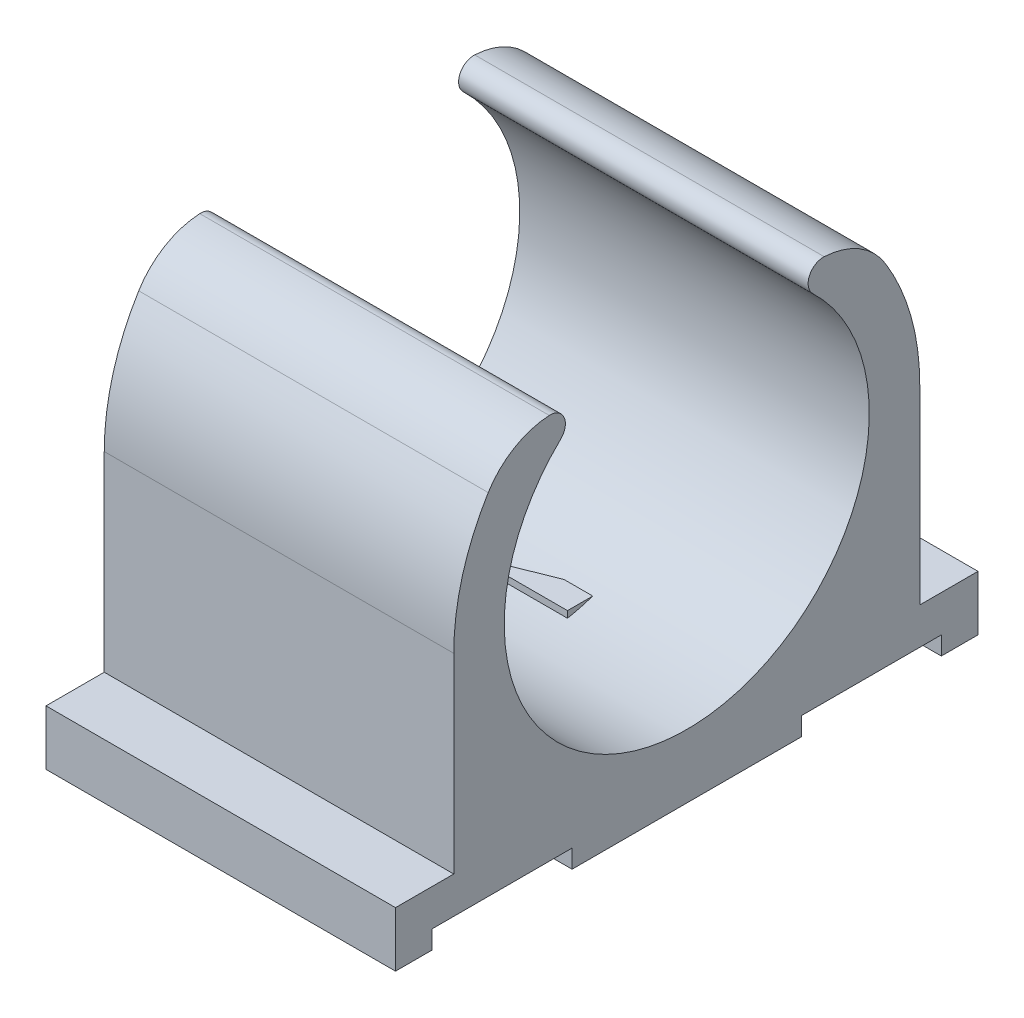
ISO-10303-21;
HEADER;
FILE_DESCRIPTION(('STEP AP214'),'2;1');
FILE_NAME('part.step','',(''),(''),'','','');
FILE_SCHEMA(('AUTOMOTIVE_DESIGN { 1 0 10303 214 1 1 1 1 }'));
ENDSEC;
DATA;
#1=APPLICATION_CONTEXT('core data for automotive mechanical design processes');
#2=APPLICATION_PROTOCOL_DEFINITION('international standard','automotive_design',2000,#1);
#3=PRODUCT_CONTEXT('',#1,'mechanical');
#4=PRODUCT('Part','Part','',(#3));
#5=PRODUCT_RELATED_PRODUCT_CATEGORY('part','',(#4));
#6=PRODUCT_DEFINITION_FORMATION('','',#4);
#7=PRODUCT_DEFINITION_CONTEXT('part definition',#1,'design');
#8=PRODUCT_DEFINITION('design','',#6,#7);
#9=PRODUCT_DEFINITION_SHAPE('','',#8);
#10=(LENGTH_UNIT() NAMED_UNIT(*) SI_UNIT(.MILLI.,.METRE.));
#11=(NAMED_UNIT(*) PLANE_ANGLE_UNIT() SI_UNIT($,.RADIAN.));
#12=(NAMED_UNIT(*) SI_UNIT($,.STERADIAN.) SOLID_ANGLE_UNIT());
#13=UNCERTAINTY_MEASURE_WITH_UNIT(LENGTH_MEASURE(1.E-05),#10,'distance_accuracy_value','');
#14=(GEOMETRIC_REPRESENTATION_CONTEXT(3) GLOBAL_UNCERTAINTY_ASSIGNED_CONTEXT((#13)) GLOBAL_UNIT_ASSIGNED_CONTEXT((#10,
#11,#12)) REPRESENTATION_CONTEXT('',''));
#15=CARTESIAN_POINT('',(0.,0.,0.));
#16=DIRECTION('',(0.,0.,1.));
#17=DIRECTION('',(1.,0.,0.));
#18=AXIS2_PLACEMENT_3D('',#15,#16,#17);
#19=CARTESIAN_POINT('',(-11.43,14.9,0.));
#20=DIRECTION('',(1.,0.,0.));
#21=DIRECTION('',(0.,0.,-1.));
#22=AXIS2_PLACEMENT_3D('',#19,#20,#21);
#23=CYLINDRICAL_SURFACE('',#22,11.938);
#24=CARTESIAN_POINT('',(-10.07,14.9,0.));
#25=DIRECTION('',(0.371390676354104,0.,0.92847669088526));
#26=DIRECTION('',(0.928476690885259,0.,-0.371390676354104));
#27=AXIS2_PLACEMENT_3D('',#24,#25,#26);
#28=ELLIPSE('',#27,32.1440487337859,11.938);
#29=CARTESIAN_POINT('',(-0.443914346942473,3.6,-3.85043426122301));
#30=VERTEX_POINT('',#29);
#31=CARTESIAN_POINT('',(-4.57,3.16646498279398,-2.2));
#32=VERTEX_POINT('',#31);
#33=EDGE_CURVE('E468',#30,#32,#28,.F.);
#34=ORIENTED_EDGE('',*,*,#33,.F.);
#35=DIRECTION('',(1.,0.,0.));
#36=VECTOR('',#35,1.);
#37=CARTESIAN_POINT('',(-11.43,3.6,-3.85043426122301));
#38=LINE('',#37,#36);
#39=CARTESIAN_POINT('',(1.43,3.6,-3.85043426122301));
#40=VERTEX_POINT('',#39);
#41=EDGE_CURVE('E461',#40,#30,#38,.F.);
#42=ORIENTED_EDGE('',*,*,#41,.F.);
#43=CARTESIAN_POINT('',(1.43,14.9,0.));
#44=DIRECTION('',(-1.,0.,0.));
#45=DIRECTION('',(0.,0.,1.));
#46=AXIS2_PLACEMENT_3D('',#43,#44,#45);
#47=CIRCLE('',#46,11.938);
#48=CARTESIAN_POINT('',(1.43,3.16646498279398,-2.2));
#49=VERTEX_POINT('',#48);
#50=EDGE_CURVE('E464',#49,#40,#47,.F.);
#51=ORIENTED_EDGE('',*,*,#50,.F.);
#52=DIRECTION('',(1.,0.,0.));
#53=VECTOR('',#52,1.);
#54=CARTESIAN_POINT('',(-11.43,3.16646498279398,-2.2));
#55=LINE('',#54,#53);
#56=EDGE_CURVE('E56',#32,#49,#55,.T.);
#57=ORIENTED_EDGE('',*,*,#56,.F.);
#58=EDGE_LOOP('',(#34,#42,#51,#57));
#59=FACE_BOUND('',#58,.T.);
#60=CARTESIAN_POINT('',(11.43,14.9,0.));
#61=DIRECTION('',(1.,0.,0.));
#62=DIRECTION('',(0.,0.,-1.));
#63=AXIS2_PLACEMENT_3D('',#60,#61,#62);
#64=CIRCLE('',#63,11.938);
#65=CARTESIAN_POINT('',(11.43,23.531318512451,8.24719253665273));
#66=VERTEX_POINT('',#65);
#67=CARTESIAN_POINT('',(11.43,23.531318512451,-8.24719253665274));
#68=VERTEX_POINT('',#67);
#69=EDGE_CURVE('E291',#66,#68,#64,.T.);
#70=ORIENTED_EDGE('',*,*,#69,.T.);
#71=DIRECTION('',(1.,0.,0.));
#72=VECTOR('',#71,1.);
#73=CARTESIAN_POINT('',(-11.43,23.531318512451,-8.24719253665273));
#74=LINE('',#73,#72);
#75=CARTESIAN_POINT('',(-11.43,23.531318512451,-8.24719253665273));
#76=VERTEX_POINT('',#75);
#77=EDGE_CURVE('E452',#68,#76,#74,.F.);
#78=ORIENTED_EDGE('',*,*,#77,.T.);
#79=CARTESIAN_POINT('',(-11.43,14.9,0.));
#80=DIRECTION('',(1.,0.,0.));
#81=DIRECTION('',(0.,0.,-1.));
#82=AXIS2_PLACEMENT_3D('',#79,#80,#81);
#83=CIRCLE('',#82,11.938);
#84=CARTESIAN_POINT('',(-11.43,23.531318512451,8.24719253665274));
#85=VERTEX_POINT('',#84);
#86=EDGE_CURVE('E292',#85,#76,#83,.T.);
#87=ORIENTED_EDGE('',*,*,#86,.F.);
#88=DIRECTION('',(1.,0.,0.));
#89=VECTOR('',#88,1.);
#90=CARTESIAN_POINT('',(-11.43,23.531318512451,8.24719253665274));
#91=LINE('',#90,#89);
#92=EDGE_CURVE('E450',#85,#66,#91,.T.);
#93=ORIENTED_EDGE('',*,*,#92,.T.);
#94=EDGE_LOOP('',(#70,#78,#87,#93));
#95=FACE_BOUND('',#94,.T.);
#96=CARTESIAN_POINT('',(1.43,14.9,0.));
#97=DIRECTION('',(-1.,0.,0.));
#98=DIRECTION('',(0.,0.,1.));
#99=AXIS2_PLACEMENT_3D('',#96,#97,#98);
#100=CIRCLE('',#99,11.938);
#101=CARTESIAN_POINT('',(1.43,3.6,3.850434261223));
#102=VERTEX_POINT('',#101);
#103=CARTESIAN_POINT('',(1.43,3.16646498279398,2.2));
#104=VERTEX_POINT('',#103);
#105=EDGE_CURVE('E11',#102,#104,#100,.F.);
#106=ORIENTED_EDGE('',*,*,#105,.F.);
#107=DIRECTION('',(1.,0.,0.));
#108=VECTOR('',#107,1.);
#109=CARTESIAN_POINT('',(-11.43,3.6,3.850434261223));
#110=LINE('',#109,#108);
#111=CARTESIAN_POINT('',(-0.443914346942504,3.6,3.850434261223));
#112=VERTEX_POINT('',#111);
#113=EDGE_CURVE('E245',#102,#112,#110,.F.);
#114=ORIENTED_EDGE('',*,*,#113,.T.);
#115=CARTESIAN_POINT('',(-10.07,14.9,0.));
#116=DIRECTION('',(0.371390676354104,0.,-0.928476690885259));
#117=DIRECTION('',(0.92847669088526,0.,0.371390676354104));
#118=AXIS2_PLACEMENT_3D('',#115,#116,#117);
#119=ELLIPSE('',#118,32.1440487337858,11.938);
#120=CARTESIAN_POINT('',(-4.57,3.16646498279398,2.2));
#121=VERTEX_POINT('',#120);
#122=EDGE_CURVE('E471',#121,#112,#119,.F.);
#123=ORIENTED_EDGE('',*,*,#122,.F.);
#124=DIRECTION('',(1.,0.,0.));
#125=VECTOR('',#124,1.);
#126=CARTESIAN_POINT('',(-11.43,3.16646498279398,2.2));
#127=LINE('',#126,#125);
#128=EDGE_CURVE('E41',#104,#121,#127,.F.);
#129=ORIENTED_EDGE('',*,*,#128,.F.);
#130=EDGE_LOOP('',(#106,#114,#123,#129));
#131=FACE_BOUND('',#130,.T.);
#132=ADVANCED_FACE('F33',(#59,#95,#131),#23,.F.);
#133=CARTESIAN_POINT('',(-11.43,25.26,-15.24));
#134=DIRECTION('',(0.,0.,1.));
#135=DIRECTION('',(1.,0.,0.));
#136=AXIS2_PLACEMENT_3D('',#133,#134,#135);
#137=PLANE('',#136);
#138=DIRECTION('',(1.,0.,0.));
#139=VECTOR('',#138,1.);
#140=CARTESIAN_POINT('',(-11.43,14.9,-15.24));
#141=LINE('',#140,#139);
#142=CARTESIAN_POINT('',(-11.43,14.9,-15.24));
#143=VERTEX_POINT('',#142);
#144=CARTESIAN_POINT('',(11.43,14.9,-15.24));
#145=VERTEX_POINT('',#144);
#146=EDGE_CURVE('E279',#143,#145,#141,.T.);
#147=ORIENTED_EDGE('',*,*,#146,.T.);
#148=DIRECTION('',(0.,-1.,0.));
#149=VECTOR('',#148,1.);
#150=CARTESIAN_POINT('',(11.43,25.26,-15.24));
#151=LINE('',#150,#149);
#152=CARTESIAN_POINT('',(11.43,2.4,-15.24));
#153=VERTEX_POINT('',#152);
#154=EDGE_CURVE('E309',#145,#153,#151,.T.);
#155=ORIENTED_EDGE('',*,*,#154,.T.);
#156=DIRECTION('',(-1.,0.,0.));
#157=VECTOR('',#156,1.);
#158=CARTESIAN_POINT('',(-11.43,2.4,-15.24));
#159=LINE('',#158,#157);
#160=CARTESIAN_POINT('',(-11.43,2.4,-15.24));
#161=VERTEX_POINT('',#160);
#162=EDGE_CURVE('E295',#153,#161,#159,.T.);
#163=ORIENTED_EDGE('',*,*,#162,.T.);
#164=DIRECTION('',(0.,-1.,0.));
#165=VECTOR('',#164,1.);
#166=CARTESIAN_POINT('',(-11.43,25.26,-15.24));
#167=LINE('',#166,#165);
#168=EDGE_CURVE('E307',#143,#161,#167,.T.);
#169=ORIENTED_EDGE('',*,*,#168,.F.);
#170=EDGE_LOOP('',(#147,#155,#163,#169));
#171=FACE_BOUND('',#170,.T.);
#172=ADVANCED_FACE('F477',(#171),#137,.F.);
#173=CARTESIAN_POINT('',(11.43,2.4,-19.05));
#174=DIRECTION('',(-1.,0.,0.));
#175=DIRECTION('',(0.,0.,1.));
#176=AXIS2_PLACEMENT_3D('',#173,#174,#175);
#177=PLANE('',#176);
#178=CARTESIAN_POINT('',(11.43,20.26,-8.72513610209033));
#179=DIRECTION('',(-1.,0.,0.));
#180=DIRECTION('',(0.,0.,1.));
#181=AXIS2_PLACEMENT_3D('',#178,#179,#180);
#182=CIRCLE('',#181,5.);
#183=CARTESIAN_POINT('',(11.43,22.8771875,-12.9854564644391));
#184=VERTEX_POINT('',#183);
#185=CARTESIAN_POINT('',(11.43,25.2529132721238,-8.99125084623285));
#186=VERTEX_POINT('',#185);
#187=EDGE_CURVE('E433',#184,#186,#182,.F.);
#188=ORIENTED_EDGE('',*,*,#187,.T.);
#189=CARTESIAN_POINT('',(11.43,24.254330617699,-8.93802789740435));
#190=DIRECTION('',(-1.,0.,0.));
#191=DIRECTION('',(0.,0.,1.));
#192=AXIS2_PLACEMENT_3D('',#189,#190,#191);
#193=CIRCLE('',#192,1.);
#194=EDGE_CURVE('E448',#186,#68,#193,.F.);
#195=ORIENTED_EDGE('',*,*,#194,.T.);
#196=ORIENTED_EDGE('',*,*,#69,.F.);
#197=CARTESIAN_POINT('',(11.43,24.254330617699,8.93802789740434));
#198=DIRECTION('',(-1.,0.,0.));
#199=DIRECTION('',(0.,0.,1.));
#200=AXIS2_PLACEMENT_3D('',#197,#198,#199);
#201=CIRCLE('',#200,1.);
#202=CARTESIAN_POINT('',(11.43,25.2529132721238,8.99125084623285));
#203=VERTEX_POINT('',#202);
#204=EDGE_CURVE('E446',#66,#203,#201,.F.);
#205=ORIENTED_EDGE('',*,*,#204,.T.);
#206=CARTESIAN_POINT('',(11.43,20.26,8.72513610209033));
#207=DIRECTION('',(-1.,0.,0.));
#208=DIRECTION('',(0.,0.,1.));
#209=AXIS2_PLACEMENT_3D('',#206,#207,#208);
#210=CIRCLE('',#209,5.);
#211=CARTESIAN_POINT('',(11.43,22.8771875,12.9854564644391));
#212=VERTEX_POINT('',#211);
#213=EDGE_CURVE('E431',#203,#212,#210,.F.);
#214=ORIENTED_EDGE('',*,*,#213,.T.);
#215=CARTESIAN_POINT('',(11.43,14.9,0.));
#216=DIRECTION('',(-1.,0.,0.));
#217=DIRECTION('',(0.,0.,-1.));
#218=AXIS2_PLACEMENT_3D('',#215,#216,#217);
#219=CIRCLE('',#218,15.24);
#220=CARTESIAN_POINT('',(11.43,14.9,15.24));
#221=VERTEX_POINT('',#220);
#222=EDGE_CURVE('E283',#221,#212,#219,.T.);
#223=ORIENTED_EDGE('',*,*,#222,.F.);
#224=DIRECTION('',(0.,-1.,0.));
#225=VECTOR('',#224,1.);
#226=CARTESIAN_POINT('',(11.43,25.26,15.24));
#227=LINE('',#226,#225);
#228=CARTESIAN_POINT('',(11.43,2.4,15.24));
#229=VERTEX_POINT('',#228);
#230=EDGE_CURVE('E303',#221,#229,#227,.T.);
#231=ORIENTED_EDGE('',*,*,#230,.T.);
#232=DIRECTION('',(0.,0.,-1.));
#233=VECTOR('',#232,1.);
#234=CARTESIAN_POINT('',(11.43,2.4,-19.05));
#235=LINE('',#234,#233);
#236=CARTESIAN_POINT('',(11.43,2.4,19.05));
#237=VERTEX_POINT('',#236);
#238=EDGE_CURVE('E403',#237,#229,#235,.T.);
#239=ORIENTED_EDGE('',*,*,#238,.F.);
#240=DIRECTION('',(0.,-1.,0.));
#241=VECTOR('',#240,1.);
#242=CARTESIAN_POINT('',(11.43,2.4,19.05));
#243=LINE('',#242,#241);
#244=CARTESIAN_POINT('',(11.43,-1.2,19.05));
#245=VERTEX_POINT('',#244);
#246=EDGE_CURVE('E415',#237,#245,#243,.T.);
#247=ORIENTED_EDGE('',*,*,#246,.T.);
#248=DIRECTION('',(0.,0.,1.));
#249=VECTOR('',#248,1.);
#250=CARTESIAN_POINT('',(11.43,-1.2,19.05));
#251=LINE('',#250,#249);
#252=CARTESIAN_POINT('',(11.43,-1.2,16.65));
#253=VERTEX_POINT('',#252);
#254=EDGE_CURVE('E339',#253,#245,#251,.T.);
#255=ORIENTED_EDGE('',*,*,#254,.F.);
#256=DIRECTION('',(0.,1.,0.));
#257=VECTOR('',#256,1.);
#258=CARTESIAN_POINT('',(11.43,-1.2,16.65));
#259=LINE('',#258,#257);
#260=CARTESIAN_POINT('',(11.43,0.,16.65));
#261=VERTEX_POINT('',#260);
#262=EDGE_CURVE('E349',#253,#261,#259,.T.);
#263=ORIENTED_EDGE('',*,*,#262,.T.);
#264=DIRECTION('',(0.,0.,-1.));
#265=VECTOR('',#264,1.);
#266=CARTESIAN_POINT('',(11.43,0.,-19.05));
#267=LINE('',#266,#265);
#268=CARTESIAN_POINT('',(11.43,0.,7.49999999999999));
#269=VERTEX_POINT('',#268);
#270=EDGE_CURVE('E416',#261,#269,#267,.T.);
#271=ORIENTED_EDGE('',*,*,#270,.T.);
#272=DIRECTION('',(0.,1.,0.));
#273=VECTOR('',#272,1.);
#274=CARTESIAN_POINT('',(11.43,-1.2,7.5));
#275=LINE('',#274,#273);
#276=CARTESIAN_POINT('',(11.43,-1.2,7.5));
#277=VERTEX_POINT('',#276);
#278=EDGE_CURVE('E393',#277,#269,#275,.T.);
#279=ORIENTED_EDGE('',*,*,#278,.F.);
#280=DIRECTION('',(0.,0.,1.));
#281=VECTOR('',#280,1.);
#282=CARTESIAN_POINT('',(11.43,-1.2,7.5));
#283=LINE('',#282,#281);
#284=CARTESIAN_POINT('',(11.43,-1.2,-7.5));
#285=VERTEX_POINT('',#284);
#286=EDGE_CURVE('E381',#285,#277,#283,.T.);
#287=ORIENTED_EDGE('',*,*,#286,.F.);
#288=DIRECTION('',(0.,1.,0.));
#289=VECTOR('',#288,1.);
#290=CARTESIAN_POINT('',(11.43,-1.2,-7.5));
#291=LINE('',#290,#289);
#292=CARTESIAN_POINT('',(11.43,0.,-7.5));
#293=VERTEX_POINT('',#292);
#294=EDGE_CURVE('E396',#285,#293,#291,.T.);
#295=ORIENTED_EDGE('',*,*,#294,.T.);
#296=CARTESIAN_POINT('',(11.43,0.,-16.65));
#297=VERTEX_POINT('',#296);
#298=EDGE_CURVE('E402',#293,#297,#267,.T.);
#299=ORIENTED_EDGE('',*,*,#298,.T.);
#300=DIRECTION('',(0.,1.,0.));
#301=VECTOR('',#300,1.);
#302=CARTESIAN_POINT('',(11.43,-1.2,-16.65));
#303=LINE('',#302,#301);
#304=CARTESIAN_POINT('',(11.43,-1.2,-16.65));
#305=VERTEX_POINT('',#304);
#306=EDGE_CURVE('E371',#305,#297,#303,.T.);
#307=ORIENTED_EDGE('',*,*,#306,.F.);
#308=DIRECTION('',(0.,0.,1.));
#309=VECTOR('',#308,1.);
#310=CARTESIAN_POINT('',(11.43,-1.2,-19.05));
#311=LINE('',#310,#309);
#312=CARTESIAN_POINT('',(11.43,-1.2,-19.05));
#313=VERTEX_POINT('',#312);
#314=EDGE_CURVE('E356',#313,#305,#311,.T.);
#315=ORIENTED_EDGE('',*,*,#314,.F.);
#316=DIRECTION('',(0.,-1.,0.));
#317=VECTOR('',#316,1.);
#318=CARTESIAN_POINT('',(11.43,2.4,-19.05));
#319=LINE('',#318,#317);
#320=CARTESIAN_POINT('',(11.43,2.4,-19.05));
#321=VERTEX_POINT('',#320);
#322=EDGE_CURVE('E426',#321,#313,#319,.T.);
#323=ORIENTED_EDGE('',*,*,#322,.F.);
#324=EDGE_CURVE('E407',#153,#321,#235,.T.);
#325=ORIENTED_EDGE('',*,*,#324,.F.);
#326=ORIENTED_EDGE('',*,*,#154,.F.);
#327=CARTESIAN_POINT('',(11.43,14.9,0.));
#328=DIRECTION('',(-1.,0.,0.));
#329=DIRECTION('',(0.,0.,-1.));
#330=AXIS2_PLACEMENT_3D('',#327,#328,#329);
#331=CIRCLE('',#330,15.24);
#332=EDGE_CURVE('E276',#184,#145,#331,.T.);
#333=ORIENTED_EDGE('',*,*,#332,.F.);
#334=EDGE_LOOP('',(#188,#195,#196,#205,#214,#223,#231,#239,#247,#255,#263,#271,#279,#287,#295,
#299,#307,#315,#323,#325,#326,#333));
#335=FACE_BOUND('',#334,.T.);
#336=ADVANCED_FACE('F482',(#335),#177,.F.);
#337=CARTESIAN_POINT('',(-11.43,2.4,-19.05));
#338=DIRECTION('',(1.,0.,0.));
#339=DIRECTION('',(0.,0.,-1.));
#340=AXIS2_PLACEMENT_3D('',#337,#338,#339);
#341=PLANE('',#340);
#342=ORIENTED_EDGE('',*,*,#86,.T.);
#343=CARTESIAN_POINT('',(-11.43,24.254330617699,-8.93802789740434));
#344=DIRECTION('',(1.,0.,0.));
#345=DIRECTION('',(0.,0.,-1.));
#346=AXIS2_PLACEMENT_3D('',#343,#344,#345);
#347=CIRCLE('',#346,1.);
#348=CARTESIAN_POINT('',(-11.43,25.2529132721238,-8.99125084623285));
#349=VERTEX_POINT('',#348);
#350=EDGE_CURVE('E456',#76,#349,#347,.F.);
#351=ORIENTED_EDGE('',*,*,#350,.T.);
#352=CARTESIAN_POINT('',(-11.43,20.26,-8.72513610209033));
#353=DIRECTION('',(1.,0.,0.));
#354=DIRECTION('',(0.,0.,-1.));
#355=AXIS2_PLACEMENT_3D('',#352,#353,#354);
#356=CIRCLE('',#355,5.);
#357=CARTESIAN_POINT('',(-11.43,22.8771875,-12.9854564644391));
#358=VERTEX_POINT('',#357);
#359=EDGE_CURVE('E439',#349,#358,#356,.F.);
#360=ORIENTED_EDGE('',*,*,#359,.T.);
#361=CARTESIAN_POINT('',(-11.43,14.9,0.));
#362=DIRECTION('',(-1.,0.,0.));
#363=DIRECTION('',(0.,0.,-1.));
#364=AXIS2_PLACEMENT_3D('',#361,#362,#363);
#365=CIRCLE('',#364,15.24);
#366=EDGE_CURVE('E277',#358,#143,#365,.T.);
#367=ORIENTED_EDGE('',*,*,#366,.T.);
#368=ORIENTED_EDGE('',*,*,#168,.T.);
#369=DIRECTION('',(0.,0.,1.));
#370=VECTOR('',#369,1.);
#371=CARTESIAN_POINT('',(-11.43,2.4,-19.05));
#372=LINE('',#371,#370);
#373=CARTESIAN_POINT('',(-11.43,2.4,-19.05));
#374=VERTEX_POINT('',#373);
#375=EDGE_CURVE('E410',#374,#161,#372,.T.);
#376=ORIENTED_EDGE('',*,*,#375,.F.);
#377=DIRECTION('',(0.,-1.,0.));
#378=VECTOR('',#377,1.);
#379=CARTESIAN_POINT('',(-11.43,2.4,-19.05));
#380=LINE('',#379,#378);
#381=CARTESIAN_POINT('',(-11.43,-1.2,-19.05));
#382=VERTEX_POINT('',#381);
#383=EDGE_CURVE('E424',#374,#382,#380,.T.);
#384=ORIENTED_EDGE('',*,*,#383,.T.);
#385=DIRECTION('',(0.,0.,-1.));
#386=VECTOR('',#385,1.);
#387=CARTESIAN_POINT('',(-11.43,-1.2,-19.05));
#388=LINE('',#387,#386);
#389=CARTESIAN_POINT('',(-11.43,-1.2,-16.65));
#390=VERTEX_POINT('',#389);
#391=EDGE_CURVE('E361',#390,#382,#388,.T.);
#392=ORIENTED_EDGE('',*,*,#391,.F.);
#393=DIRECTION('',(0.,1.,0.));
#394=VECTOR('',#393,1.);
#395=CARTESIAN_POINT('',(-11.43,-1.2,-16.65));
#396=LINE('',#395,#394);
#397=CARTESIAN_POINT('',(-11.43,0.,-16.65));
#398=VERTEX_POINT('',#397);
#399=EDGE_CURVE('E367',#390,#398,#396,.T.);
#400=ORIENTED_EDGE('',*,*,#399,.T.);
#401=DIRECTION('',(0.,0.,1.));
#402=VECTOR('',#401,1.);
#403=CARTESIAN_POINT('',(-11.43,0.,-19.05));
#404=LINE('',#403,#402);
#405=CARTESIAN_POINT('',(-11.43,0.,-7.5));
#406=VERTEX_POINT('',#405);
#407=EDGE_CURVE('E419',#398,#406,#404,.T.);
#408=ORIENTED_EDGE('',*,*,#407,.T.);
#409=DIRECTION('',(0.,1.,0.));
#410=VECTOR('',#409,1.);
#411=CARTESIAN_POINT('',(-11.43,-1.2,-7.5));
#412=LINE('',#411,#410);
#413=CARTESIAN_POINT('',(-11.43,-1.2,-7.5));
#414=VERTEX_POINT('',#413);
#415=EDGE_CURVE('E399',#414,#406,#412,.T.);
#416=ORIENTED_EDGE('',*,*,#415,.F.);
#417=DIRECTION('',(0.,0.,-1.));
#418=VECTOR('',#417,1.);
#419=CARTESIAN_POINT('',(-11.43,-1.2,7.5));
#420=LINE('',#419,#418);
#421=CARTESIAN_POINT('',(-11.43,-1.2,7.5));
#422=VERTEX_POINT('',#421);
#423=EDGE_CURVE('E374',#422,#414,#420,.T.);
#424=ORIENTED_EDGE('',*,*,#423,.F.);
#425=DIRECTION('',(0.,1.,0.));
#426=VECTOR('',#425,1.);
#427=CARTESIAN_POINT('',(-11.43,-1.2,7.5));
#428=LINE('',#427,#426);
#429=CARTESIAN_POINT('',(-11.43,0.,7.49999999999999));
#430=VERTEX_POINT('',#429);
#431=EDGE_CURVE('E386',#422,#430,#428,.T.);
#432=ORIENTED_EDGE('',*,*,#431,.T.);
#433=CARTESIAN_POINT('',(-11.43,0.,16.65));
#434=VERTEX_POINT('',#433);
#435=EDGE_CURVE('E418',#430,#434,#404,.T.);
#436=ORIENTED_EDGE('',*,*,#435,.T.);
#437=DIRECTION('',(0.,1.,0.));
#438=VECTOR('',#437,1.);
#439=CARTESIAN_POINT('',(-11.43,-1.2,16.65));
#440=LINE('',#439,#438);
#441=CARTESIAN_POINT('',(-11.43,-1.2,16.65));
#442=VERTEX_POINT('',#441);
#443=EDGE_CURVE('E353',#442,#434,#440,.T.);
#444=ORIENTED_EDGE('',*,*,#443,.F.);
#445=DIRECTION('',(0.,0.,-1.));
#446=VECTOR('',#445,1.);
#447=CARTESIAN_POINT('',(-11.43,-1.2,19.05));
#448=LINE('',#447,#446);
#449=CARTESIAN_POINT('',(-11.43,-1.2,19.05));
#450=VERTEX_POINT('',#449);
#451=EDGE_CURVE('E345',#450,#442,#448,.T.);
#452=ORIENTED_EDGE('',*,*,#451,.F.);
#453=DIRECTION('',(0.,-1.,0.));
#454=VECTOR('',#453,1.);
#455=CARTESIAN_POINT('',(-11.43,2.4,19.05));
#456=LINE('',#455,#454);
#457=CARTESIAN_POINT('',(-11.43,2.4,19.05));
#458=VERTEX_POINT('',#457);
#459=EDGE_CURVE('E422',#458,#450,#456,.T.);
#460=ORIENTED_EDGE('',*,*,#459,.F.);
#461=CARTESIAN_POINT('',(-11.43,2.4,15.24));
#462=VERTEX_POINT('',#461);
#463=EDGE_CURVE('E409',#462,#458,#372,.T.);
#464=ORIENTED_EDGE('',*,*,#463,.F.);
#465=DIRECTION('',(0.,-1.,0.));
#466=VECTOR('',#465,1.);
#467=CARTESIAN_POINT('',(-11.43,25.26,15.24));
#468=LINE('',#467,#466);
#469=CARTESIAN_POINT('',(-11.43,14.9,15.24));
#470=VERTEX_POINT('',#469);
#471=EDGE_CURVE('E305',#470,#462,#468,.T.);
#472=ORIENTED_EDGE('',*,*,#471,.F.);
#473=CARTESIAN_POINT('',(-11.43,14.9,0.));
#474=DIRECTION('',(-1.,0.,0.));
#475=DIRECTION('',(0.,0.,-1.));
#476=AXIS2_PLACEMENT_3D('',#473,#474,#475);
#477=CIRCLE('',#476,15.24);
#478=CARTESIAN_POINT('',(-11.43,22.8771875,12.9854564644391));
#479=VERTEX_POINT('',#478);
#480=EDGE_CURVE('E284',#470,#479,#477,.T.);
#481=ORIENTED_EDGE('',*,*,#480,.T.);
#482=CARTESIAN_POINT('',(-11.43,20.26,8.72513610209033));
#483=DIRECTION('',(1.,0.,0.));
#484=DIRECTION('',(0.,0.,-1.));
#485=AXIS2_PLACEMENT_3D('',#482,#483,#484);
#486=CIRCLE('',#485,5.);
#487=CARTESIAN_POINT('',(-11.43,25.2529132721238,8.99125084623285));
#488=VERTEX_POINT('',#487);
#489=EDGE_CURVE('E436',#479,#488,#486,.F.);
#490=ORIENTED_EDGE('',*,*,#489,.T.);
#491=CARTESIAN_POINT('',(-11.43,24.254330617699,8.93802789740435));
#492=DIRECTION('',(1.,0.,0.));
#493=DIRECTION('',(0.,0.,-1.));
#494=AXIS2_PLACEMENT_3D('',#491,#492,#493);
#495=CIRCLE('',#494,1.);
#496=EDGE_CURVE('E454',#488,#85,#495,.F.);
#497=ORIENTED_EDGE('',*,*,#496,.T.);
#498=EDGE_LOOP('',(#342,#351,#360,#367,#368,#376,#384,#392,#400,#408,#416,#424,#432,#436,#444,
#452,#460,#464,#472,#481,#490,#497));
#499=FACE_BOUND('',#498,.T.);
#500=ADVANCED_FACE('F550',(#499),#341,.F.);
#501=CARTESIAN_POINT('',(0.,2.4,0.));
#502=DIRECTION('',(0.,1.,0.));
#503=DIRECTION('',(0.,0.,1.));
#504=AXIS2_PLACEMENT_3D('',#501,#502,#503);
#505=PLANE('',#504);
#506=DIRECTION('',(1.,0.,0.));
#507=VECTOR('',#506,1.);
#508=CARTESIAN_POINT('',(-11.43,2.4,15.24));
#509=LINE('',#508,#507);
#510=EDGE_CURVE('E300',#462,#229,#509,.T.);
#511=ORIENTED_EDGE('',*,*,#510,.F.);
#512=ORIENTED_EDGE('',*,*,#463,.T.);
#513=DIRECTION('',(1.,0.,0.));
#514=VECTOR('',#513,1.);
#515=CARTESIAN_POINT('',(-11.43,2.4,19.05));
#516=LINE('',#515,#514);
#517=EDGE_CURVE('E413',#458,#237,#516,.T.);
#518=ORIENTED_EDGE('',*,*,#517,.T.);
#519=ORIENTED_EDGE('',*,*,#238,.T.);
#520=EDGE_LOOP('',(#511,#512,#518,#519));
#521=FACE_BOUND('',#520,.T.);
#522=ADVANCED_FACE('F527',(#521),#505,.T.);
#523=CARTESIAN_POINT('',(0.,-1.2,0.));
#524=DIRECTION('',(0.,1.,0.));
#525=DIRECTION('',(0.,0.,1.));
#526=AXIS2_PLACEMENT_3D('',#523,#524,#525);
#527=PLANE('',#526);
#528=DIRECTION('',(0.,0.,1.));
#529=VECTOR('',#528,1.);
#530=CARTESIAN_POINT('',(7.5,-1.2,-7.5));
#531=LINE('',#530,#529);
#532=CARTESIAN_POINT('',(7.5,-1.2,-7.5));
#533=VERTEX_POINT('',#532);
#534=CARTESIAN_POINT('',(7.5,-1.2,7.5));
#535=VERTEX_POINT('',#534);
#536=EDGE_CURVE('E311',#533,#535,#531,.T.);
#537=ORIENTED_EDGE('',*,*,#536,.F.);
#538=DIRECTION('',(1.,0.,0.));
#539=VECTOR('',#538,1.);
#540=CARTESIAN_POINT('',(11.43,-1.2,-7.5));
#541=LINE('',#540,#539);
#542=EDGE_CURVE('E377',#533,#285,#541,.T.);
#543=ORIENTED_EDGE('',*,*,#542,.T.);
#544=ORIENTED_EDGE('',*,*,#286,.T.);
#545=DIRECTION('',(-1.,0.,0.));
#546=VECTOR('',#545,1.);
#547=CARTESIAN_POINT('',(11.43,-1.2,7.5));
#548=LINE('',#547,#546);
#549=EDGE_CURVE('E384',#277,#535,#548,.T.);
#550=ORIENTED_EDGE('',*,*,#549,.T.);
#551=EDGE_LOOP('',(#537,#543,#544,#550));
#552=FACE_BOUND('',#551,.T.);
#553=ADVANCED_FACE('F523',(#552),#527,.F.);
#554=DIRECTION('',(0.,0.,-1.));
#555=VECTOR('',#554,1.);
#556=CARTESIAN_POINT('',(-7.5,-1.2,-7.5));
#557=LINE('',#556,#555);
#558=CARTESIAN_POINT('',(-7.5,-1.2,7.5));
#559=VERTEX_POINT('',#558);
#560=CARTESIAN_POINT('',(-7.5,-1.2,-7.5));
#561=VERTEX_POINT('',#560);
#562=EDGE_CURVE('E316',#559,#561,#557,.T.);
#563=ORIENTED_EDGE('',*,*,#562,.F.);
#564=EDGE_CURVE('E383',#559,#422,#548,.T.);
#565=ORIENTED_EDGE('',*,*,#564,.T.);
#566=ORIENTED_EDGE('',*,*,#423,.T.);
#567=EDGE_CURVE('E379',#414,#561,#541,.T.);
#568=ORIENTED_EDGE('',*,*,#567,.T.);
#569=EDGE_LOOP('',(#563,#565,#566,#568));
#570=FACE_BOUND('',#569,.T.);
#571=ADVANCED_FACE('F526',(#570),#527,.F.);
#572=CARTESIAN_POINT('',(0.,0.,0.));
#573=DIRECTION('',(0.,1.,0.));
#574=DIRECTION('',(0.,0.,1.));
#575=AXIS2_PLACEMENT_3D('',#572,#573,#574);
#576=PLANE('',#575);
#577=DIRECTION('',(1.,0.,0.));
#578=VECTOR('',#577,1.);
#579=CARTESIAN_POINT('',(11.43,0.,16.65));
#580=LINE('',#579,#578);
#581=EDGE_CURVE('E338',#434,#261,#580,.T.);
#582=ORIENTED_EDGE('',*,*,#581,.F.);
#583=ORIENTED_EDGE('',*,*,#435,.F.);
#584=DIRECTION('',(-1.,0.,0.));
#585=VECTOR('',#584,1.);
#586=CARTESIAN_POINT('',(11.43,0.,7.5));
#587=LINE('',#586,#585);
#588=EDGE_CURVE('E378',#269,#430,#587,.T.);
#589=ORIENTED_EDGE('',*,*,#588,.F.);
#590=ORIENTED_EDGE('',*,*,#270,.F.);
#591=EDGE_LOOP('',(#582,#583,#589,#590));
#592=FACE_BOUND('',#591,.T.);
#593=ADVANCED_FACE('F541',(#592),#576,.F.);
#594=DIRECTION('',(-1.,0.,0.));
#595=VECTOR('',#594,1.);
#596=CARTESIAN_POINT('',(11.43,0.,-16.65));
#597=LINE('',#596,#595);
#598=EDGE_CURVE('E355',#297,#398,#597,.T.);
#599=ORIENTED_EDGE('',*,*,#598,.F.);
#600=ORIENTED_EDGE('',*,*,#298,.F.);
#601=DIRECTION('',(1.,0.,0.));
#602=VECTOR('',#601,1.);
#603=CARTESIAN_POINT('',(11.43,0.,-7.5));
#604=LINE('',#603,#602);
#605=EDGE_CURVE('E373',#406,#293,#604,.T.);
#606=ORIENTED_EDGE('',*,*,#605,.F.);
#607=ORIENTED_EDGE('',*,*,#407,.F.);
#608=EDGE_LOOP('',(#599,#600,#606,#607));
#609=FACE_BOUND('',#608,.T.);
#610=ADVANCED_FACE('F544',(#609),#576,.F.);
#611=CARTESIAN_POINT('',(-11.43,2.4,-19.05));
#612=DIRECTION('',(0.,0.,1.));
#613=DIRECTION('',(1.,0.,0.));
#614=AXIS2_PLACEMENT_3D('',#611,#612,#613);
#615=PLANE('',#614);
#616=ORIENTED_EDGE('',*,*,#322,.T.);
#617=DIRECTION('',(1.,0.,0.));
#618=VECTOR('',#617,1.);
#619=CARTESIAN_POINT('',(11.43,-1.2,-19.05));
#620=LINE('',#619,#618);
#621=EDGE_CURVE('E364',#382,#313,#620,.T.);
#622=ORIENTED_EDGE('',*,*,#621,.F.);
#623=ORIENTED_EDGE('',*,*,#383,.F.);
#624=DIRECTION('',(-1.,0.,0.));
#625=VECTOR('',#624,1.);
#626=CARTESIAN_POINT('',(-11.43,2.4,-19.05));
#627=LINE('',#626,#625);
#628=EDGE_CURVE('E406',#321,#374,#627,.T.);
#629=ORIENTED_EDGE('',*,*,#628,.F.);
#630=EDGE_LOOP('',(#616,#622,#623,#629));
#631=FACE_BOUND('',#630,.T.);
#632=ADVANCED_FACE('F548',(#631),#615,.F.);
#633=CARTESIAN_POINT('',(-11.43,2.4,19.05));
#634=DIRECTION('',(0.,0.,-1.));
#635=DIRECTION('',(-1.,0.,0.));
#636=AXIS2_PLACEMENT_3D('',#633,#634,#635);
#637=PLANE('',#636);
#638=ORIENTED_EDGE('',*,*,#459,.T.);
#639=DIRECTION('',(-1.,0.,0.));
#640=VECTOR('',#639,1.);
#641=CARTESIAN_POINT('',(11.43,-1.2,19.05));
#642=LINE('',#641,#640);
#643=EDGE_CURVE('E342',#245,#450,#642,.T.);
#644=ORIENTED_EDGE('',*,*,#643,.F.);
#645=ORIENTED_EDGE('',*,*,#246,.F.);
#646=ORIENTED_EDGE('',*,*,#517,.F.);
#647=EDGE_LOOP('',(#638,#644,#645,#646));
#648=FACE_BOUND('',#647,.T.);
#649=ADVANCED_FACE('F539',(#648),#637,.F.);
#650=ORIENTED_EDGE('',*,*,#162,.F.);
#651=ORIENTED_EDGE('',*,*,#324,.T.);
#652=ORIENTED_EDGE('',*,*,#628,.T.);
#653=ORIENTED_EDGE('',*,*,#375,.T.);
#654=EDGE_LOOP('',(#650,#651,#652,#653));
#655=FACE_BOUND('',#654,.T.);
#656=ADVANCED_FACE('F535',(#655),#505,.T.);
#657=CARTESIAN_POINT('',(11.43,-1.2,-7.5));
#658=DIRECTION('',(0.,0.,1.));
#659=DIRECTION('',(1.,0.,0.));
#660=AXIS2_PLACEMENT_3D('',#657,#658,#659);
#661=PLANE('',#660);
#662=ORIENTED_EDGE('',*,*,#605,.T.);
#663=ORIENTED_EDGE('',*,*,#294,.F.);
#664=ORIENTED_EDGE('',*,*,#542,.F.);
#665=DIRECTION('',(0.,1.,0.));
#666=VECTOR('',#665,1.);
#667=CARTESIAN_POINT('',(7.5,-3.2,-7.5));
#668=LINE('',#667,#666);
#669=CARTESIAN_POINT('',(7.5,-3.2,-7.5));
#670=VERTEX_POINT('',#669);
#671=EDGE_CURVE('E322',#670,#533,#668,.T.);
#672=ORIENTED_EDGE('',*,*,#671,.F.);
#673=DIRECTION('',(1.,0.,0.));
#674=VECTOR('',#673,1.);
#675=CARTESIAN_POINT('',(-7.5,-3.2,-7.5));
#676=LINE('',#675,#674);
#677=CARTESIAN_POINT('',(-7.5,-3.2,-7.5));
#678=VERTEX_POINT('',#677);
#679=EDGE_CURVE('E320',#678,#670,#676,.T.);
#680=ORIENTED_EDGE('',*,*,#679,.F.);
#681=DIRECTION('',(0.,1.,0.));
#682=VECTOR('',#681,1.);
#683=CARTESIAN_POINT('',(-7.5,-3.2,-7.5));
#684=LINE('',#683,#682);
#685=EDGE_CURVE('E329',#678,#561,#684,.T.);
#686=ORIENTED_EDGE('',*,*,#685,.T.);
#687=ORIENTED_EDGE('',*,*,#567,.F.);
#688=ORIENTED_EDGE('',*,*,#415,.T.);
#689=EDGE_LOOP('',(#662,#663,#664,#672,#680,#686,#687,#688));
#690=FACE_BOUND('',#689,.T.);
#691=ADVANCED_FACE('F531',(#690),#661,.F.);
#692=CARTESIAN_POINT('',(11.43,-1.2,7.5));
#693=DIRECTION('',(0.,0.,-1.));
#694=DIRECTION('',(-1.,0.,0.));
#695=AXIS2_PLACEMENT_3D('',#692,#693,#694);
#696=PLANE('',#695);
#697=ORIENTED_EDGE('',*,*,#588,.T.);
#698=ORIENTED_EDGE('',*,*,#431,.F.);
#699=ORIENTED_EDGE('',*,*,#564,.F.);
#700=DIRECTION('',(0.,1.,0.));
#701=VECTOR('',#700,1.);
#702=CARTESIAN_POINT('',(-7.5,-3.2,7.5));
#703=LINE('',#702,#701);
#704=CARTESIAN_POINT('',(-7.5,-3.2,7.5));
#705=VERTEX_POINT('',#704);
#706=EDGE_CURVE('E332',#705,#559,#703,.T.);
#707=ORIENTED_EDGE('',*,*,#706,.F.);
#708=DIRECTION('',(-1.,0.,0.));
#709=VECTOR('',#708,1.);
#710=CARTESIAN_POINT('',(-7.5,-3.2,7.5));
#711=LINE('',#710,#709);
#712=CARTESIAN_POINT('',(7.5,-3.2,7.5));
#713=VERTEX_POINT('',#712);
#714=EDGE_CURVE('E315',#713,#705,#711,.T.);
#715=ORIENTED_EDGE('',*,*,#714,.F.);
#716=DIRECTION('',(0.,1.,0.));
#717=VECTOR('',#716,1.);
#718=CARTESIAN_POINT('',(7.5,-3.2,7.5));
#719=LINE('',#718,#717);
#720=EDGE_CURVE('E335',#713,#535,#719,.T.);
#721=ORIENTED_EDGE('',*,*,#720,.T.);
#722=ORIENTED_EDGE('',*,*,#549,.F.);
#723=ORIENTED_EDGE('',*,*,#278,.T.);
#724=EDGE_LOOP('',(#697,#698,#699,#707,#715,#721,#722,#723));
#725=FACE_BOUND('',#724,.T.);
#726=ADVANCED_FACE('F521',(#725),#696,.F.);
#727=CARTESIAN_POINT('',(11.43,-1.2,-16.65));
#728=DIRECTION('',(0.,0.,-1.));
#729=DIRECTION('',(-1.,0.,0.));
#730=AXIS2_PLACEMENT_3D('',#727,#728,#729);
#731=PLANE('',#730);
#732=ORIENTED_EDGE('',*,*,#598,.T.);
#733=ORIENTED_EDGE('',*,*,#399,.F.);
#734=DIRECTION('',(-1.,0.,0.));
#735=VECTOR('',#734,1.);
#736=CARTESIAN_POINT('',(11.43,-1.2,-16.65));
#737=LINE('',#736,#735);
#738=EDGE_CURVE('E359',#305,#390,#737,.T.);
#739=ORIENTED_EDGE('',*,*,#738,.F.);
#740=ORIENTED_EDGE('',*,*,#306,.T.);
#741=EDGE_LOOP('',(#732,#733,#739,#740));
#742=FACE_BOUND('',#741,.T.);
#743=ADVANCED_FACE('F517',(#742),#731,.F.);
#744=CARTESIAN_POINT('',(0.,-1.2,0.));
#745=DIRECTION('',(0.,-1.,0.));
#746=DIRECTION('',(0.,0.,-1.));
#747=AXIS2_PLACEMENT_3D('',#744,#745,#746);
#748=PLANE('',#747);
#749=ORIENTED_EDGE('',*,*,#314,.T.);
#750=ORIENTED_EDGE('',*,*,#738,.T.);
#751=ORIENTED_EDGE('',*,*,#391,.T.);
#752=ORIENTED_EDGE('',*,*,#621,.T.);
#753=EDGE_LOOP('',(#749,#750,#751,#752));
#754=FACE_BOUND('',#753,.T.);
#755=ADVANCED_FACE('F513',(#754),#748,.T.);
#756=CARTESIAN_POINT('',(11.43,-1.2,16.65));
#757=DIRECTION('',(0.,0.,1.));
#758=DIRECTION('',(1.,0.,0.));
#759=AXIS2_PLACEMENT_3D('',#756,#757,#758);
#760=PLANE('',#759);
#761=ORIENTED_EDGE('',*,*,#581,.T.);
#762=ORIENTED_EDGE('',*,*,#262,.F.);
#763=DIRECTION('',(1.,0.,0.));
#764=VECTOR('',#763,1.);
#765=CARTESIAN_POINT('',(11.43,-1.2,16.65));
#766=LINE('',#765,#764);
#767=EDGE_CURVE('E347',#442,#253,#766,.T.);
#768=ORIENTED_EDGE('',*,*,#767,.F.);
#769=ORIENTED_EDGE('',*,*,#443,.T.);
#770=EDGE_LOOP('',(#761,#762,#768,#769));
#771=FACE_BOUND('',#770,.T.);
#772=ADVANCED_FACE('F509',(#771),#760,.F.);
#773=CARTESIAN_POINT('',(0.,-1.2,0.));
#774=DIRECTION('',(0.,1.,0.));
#775=DIRECTION('',(0.,0.,1.));
#776=AXIS2_PLACEMENT_3D('',#773,#774,#775);
#777=PLANE('',#776);
#778=ORIENTED_EDGE('',*,*,#254,.T.);
#779=ORIENTED_EDGE('',*,*,#643,.T.);
#780=ORIENTED_EDGE('',*,*,#451,.T.);
#781=ORIENTED_EDGE('',*,*,#767,.T.);
#782=EDGE_LOOP('',(#778,#779,#780,#781));
#783=FACE_BOUND('',#782,.T.);
#784=ADVANCED_FACE('F505',(#783),#777,.F.);
#785=CARTESIAN_POINT('',(7.5,-3.2,-7.5));
#786=DIRECTION('',(-1.,0.,0.));
#787=DIRECTION('',(0.,0.,1.));
#788=AXIS2_PLACEMENT_3D('',#785,#786,#787);
#789=PLANE('',#788);
#790=ORIENTED_EDGE('',*,*,#536,.T.);
#791=ORIENTED_EDGE('',*,*,#720,.F.);
#792=DIRECTION('',(0.,0.,1.));
#793=VECTOR('',#792,1.);
#794=CARTESIAN_POINT('',(7.5,-3.2,-7.5));
#795=LINE('',#794,#793);
#796=EDGE_CURVE('E312',#670,#713,#795,.T.);
#797=ORIENTED_EDGE('',*,*,#796,.F.);
#798=ORIENTED_EDGE('',*,*,#671,.T.);
#799=EDGE_LOOP('',(#790,#791,#797,#798));
#800=FACE_BOUND('',#799,.T.);
#801=ADVANCED_FACE('F501',(#800),#789,.F.);
#802=CARTESIAN_POINT('',(-7.5,-3.2,-7.5));
#803=DIRECTION('',(1.,0.,0.));
#804=DIRECTION('',(0.,0.,-1.));
#805=AXIS2_PLACEMENT_3D('',#802,#803,#804);
#806=PLANE('',#805);
#807=ORIENTED_EDGE('',*,*,#562,.T.);
#808=ORIENTED_EDGE('',*,*,#685,.F.);
#809=DIRECTION('',(0.,0.,-1.));
#810=VECTOR('',#809,1.);
#811=CARTESIAN_POINT('',(-7.5,-3.2,-7.5));
#812=LINE('',#811,#810);
#813=EDGE_CURVE('E318',#705,#678,#812,.T.);
#814=ORIENTED_EDGE('',*,*,#813,.F.);
#815=ORIENTED_EDGE('',*,*,#706,.T.);
#816=EDGE_LOOP('',(#807,#808,#814,#815));
#817=FACE_BOUND('',#816,.T.);
#818=ADVANCED_FACE('F497',(#817),#806,.F.);
#819=CARTESIAN_POINT('',(0.,-3.2,0.));
#820=DIRECTION('',(0.,1.,0.));
#821=DIRECTION('',(0.,0.,1.));
#822=AXIS2_PLACEMENT_3D('',#819,#820,#821);
#823=PLANE('',#822);
#824=ORIENTED_EDGE('',*,*,#796,.T.);
#825=ORIENTED_EDGE('',*,*,#714,.T.);
#826=ORIENTED_EDGE('',*,*,#813,.T.);
#827=ORIENTED_EDGE('',*,*,#679,.T.);
#828=EDGE_LOOP('',(#824,#825,#826,#827));
#829=FACE_BOUND('',#828,.T.);
#830=ADVANCED_FACE('F492',(#829),#823,.F.);
#831=CARTESIAN_POINT('',(-11.43,25.26,15.24));
#832=DIRECTION('',(0.,0.,-1.));
#833=DIRECTION('',(-1.,0.,0.));
#834=AXIS2_PLACEMENT_3D('',#831,#832,#833);
#835=PLANE('',#834);
#836=ORIENTED_EDGE('',*,*,#230,.F.);
#837=DIRECTION('',(1.,0.,0.));
#838=VECTOR('',#837,1.);
#839=CARTESIAN_POINT('',(-11.43,14.9,15.24));
#840=LINE('',#839,#838);
#841=EDGE_CURVE('E287',#470,#221,#840,.T.);
#842=ORIENTED_EDGE('',*,*,#841,.F.);
#843=ORIENTED_EDGE('',*,*,#471,.T.);
#844=ORIENTED_EDGE('',*,*,#510,.T.);
#845=EDGE_LOOP('',(#836,#842,#843,#844));
#846=FACE_BOUND('',#845,.T.);
#847=ADVANCED_FACE('F490',(#846),#835,.F.);
#848=CARTESIAN_POINT('',(-11.43,14.9,0.));
#849=DIRECTION('',(1.,0.,0.));
#850=DIRECTION('',(0.,0.,-1.));
#851=AXIS2_PLACEMENT_3D('',#848,#849,#850);
#852=CYLINDRICAL_SURFACE('',#851,15.24);
#853=ORIENTED_EDGE('',*,*,#222,.T.);
#854=DIRECTION('',(1.,0.,0.));
#855=VECTOR('',#854,1.);
#856=CARTESIAN_POINT('',(-11.43,22.8771875,12.9854564644391));
#857=LINE('',#856,#855);
#858=EDGE_CURVE('E441',#212,#479,#857,.F.);
#859=ORIENTED_EDGE('',*,*,#858,.T.);
#860=ORIENTED_EDGE('',*,*,#480,.F.);
#861=ORIENTED_EDGE('',*,*,#841,.T.);
#862=EDGE_LOOP('',(#853,#859,#860,#861));
#863=FACE_BOUND('',#862,.T.);
#864=ADVANCED_FACE('F488',(#863),#852,.T.);
#865=CARTESIAN_POINT('',(-11.43,14.9,0.));
#866=DIRECTION('',(1.,0.,0.));
#867=DIRECTION('',(0.,0.,-1.));
#868=AXIS2_PLACEMENT_3D('',#865,#866,#867);
#869=CYLINDRICAL_SURFACE('',#868,15.24);
#870=ORIENTED_EDGE('',*,*,#366,.F.);
#871=DIRECTION('',(1.,0.,0.));
#872=VECTOR('',#871,1.);
#873=CARTESIAN_POINT('',(-11.43,22.8771875,-12.9854564644391));
#874=LINE('',#873,#872);
#875=EDGE_CURVE('E428',#358,#184,#874,.T.);
#876=ORIENTED_EDGE('',*,*,#875,.T.);
#877=ORIENTED_EDGE('',*,*,#332,.T.);
#878=ORIENTED_EDGE('',*,*,#146,.F.);
#879=EDGE_LOOP('',(#870,#876,#877,#878));
#880=FACE_BOUND('',#879,.T.);
#881=ADVANCED_FACE('F564',(#880),#869,.T.);
#882=CARTESIAN_POINT('',(-11.43,20.26,-8.72513610209033));
#883=DIRECTION('',(1.,0.,0.));
#884=DIRECTION('',(0.,0.,-1.));
#885=AXIS2_PLACEMENT_3D('',#882,#883,#884);
#886=CYLINDRICAL_SURFACE('',#885,5.);
#887=ORIENTED_EDGE('',*,*,#359,.F.);
#888=DIRECTION('',(1.,0.,0.));
#889=VECTOR('',#888,1.);
#890=CARTESIAN_POINT('',(-11.43,25.2529132721238,-8.99125084623285));
#891=LINE('',#890,#889);
#892=EDGE_CURVE('E443',#349,#186,#891,.T.);
#893=ORIENTED_EDGE('',*,*,#892,.T.);
#894=ORIENTED_EDGE('',*,*,#187,.F.);
#895=ORIENTED_EDGE('',*,*,#875,.F.);
#896=EDGE_LOOP('',(#887,#893,#894,#895));
#897=FACE_BOUND('',#896,.T.);
#898=ADVANCED_FACE('F560',(#897),#886,.T.);
#899=CARTESIAN_POINT('',(-11.43,20.26,8.72513610209033));
#900=DIRECTION('',(1.,0.,0.));
#901=DIRECTION('',(0.,0.,-1.));
#902=AXIS2_PLACEMENT_3D('',#899,#900,#901);
#903=CYLINDRICAL_SURFACE('',#902,5.);
#904=ORIENTED_EDGE('',*,*,#213,.F.);
#905=DIRECTION('',(1.,0.,0.));
#906=VECTOR('',#905,1.);
#907=CARTESIAN_POINT('',(-11.43,25.2529132721238,8.99125084623285));
#908=LINE('',#907,#906);
#909=EDGE_CURVE('E458',#203,#488,#908,.F.);
#910=ORIENTED_EDGE('',*,*,#909,.T.);
#911=ORIENTED_EDGE('',*,*,#489,.F.);
#912=ORIENTED_EDGE('',*,*,#858,.F.);
#913=EDGE_LOOP('',(#904,#910,#911,#912));
#914=FACE_BOUND('',#913,.T.);
#915=ADVANCED_FACE('F563',(#914),#903,.T.);
#916=CARTESIAN_POINT('',(-11.43,24.254330617699,-8.93802789740434));
#917=DIRECTION('',(-1.,0.,0.));
#918=DIRECTION('',(0.,0.,1.));
#919=AXIS2_PLACEMENT_3D('',#916,#917,#918);
#920=CYLINDRICAL_SURFACE('',#919,1.);
#921=ORIENTED_EDGE('',*,*,#350,.F.);
#922=ORIENTED_EDGE('',*,*,#77,.F.);
#923=ORIENTED_EDGE('',*,*,#194,.F.);
#924=ORIENTED_EDGE('',*,*,#892,.F.);
#925=EDGE_LOOP('',(#921,#922,#923,#924));
#926=FACE_BOUND('',#925,.T.);
#927=ADVANCED_FACE('F567',(#926),#920,.T.);
#928=CARTESIAN_POINT('',(-11.43,24.254330617699,8.93802789740435));
#929=DIRECTION('',(1.,0.,0.));
#930=DIRECTION('',(0.,0.,-1.));
#931=AXIS2_PLACEMENT_3D('',#928,#929,#930);
#932=CYLINDRICAL_SURFACE('',#931,1.);
#933=ORIENTED_EDGE('',*,*,#204,.F.);
#934=ORIENTED_EDGE('',*,*,#92,.F.);
#935=ORIENTED_EDGE('',*,*,#496,.F.);
#936=ORIENTED_EDGE('',*,*,#909,.F.);
#937=EDGE_LOOP('',(#933,#934,#935,#936));
#938=FACE_BOUND('',#937,.T.);
#939=ADVANCED_FACE('F35',(#938),#932,.T.);
#940=CARTESIAN_POINT('',(1.43,3.6,-4.6));
#941=DIRECTION('',(0.371390676354104,0.,0.92847669088526));
#942=DIRECTION('',(0.928476690885259,0.,-0.371390676354104));
#943=AXIS2_PLACEMENT_3D('',#940,#941,#942);
#944=PLANE('',#943);
#945=DIRECTION('',(-0.928476690885259,0.,0.371390676354104));
#946=VECTOR('',#945,1.);
#947=CARTESIAN_POINT('',(1.43,3.6,-4.6));
#948=LINE('',#947,#946);
#949=CARTESIAN_POINT('',(-4.57,3.6,-2.2));
#950=VERTEX_POINT('',#949);
#951=EDGE_CURVE('E259',#30,#950,#948,.T.);
#952=ORIENTED_EDGE('',*,*,#951,.F.);
#953=ORIENTED_EDGE('',*,*,#33,.T.);
#954=DIRECTION('',(0.,-1.,0.));
#955=VECTOR('',#954,1.);
#956=CARTESIAN_POINT('',(-4.57,3.6,-2.2));
#957=LINE('',#956,#955);
#958=EDGE_CURVE('E273',#950,#32,#957,.T.);
#959=ORIENTED_EDGE('',*,*,#958,.F.);
#960=EDGE_LOOP('',(#952,#953,#959));
#961=FACE_BOUND('',#960,.T.);
#962=ADVANCED_FACE('F574',(#961),#944,.F.);
#963=CARTESIAN_POINT('',(-4.57,3.6,-2.2));
#964=DIRECTION('',(0.,0.,-1.));
#965=DIRECTION('',(-1.,0.,0.));
#966=AXIS2_PLACEMENT_3D('',#963,#964,#965);
#967=PLANE('',#966);
#968=ORIENTED_EDGE('',*,*,#958,.T.);
#969=ORIENTED_EDGE('',*,*,#56,.T.);
#970=DIRECTION('',(0.,-1.,0.));
#971=VECTOR('',#970,1.);
#972=CARTESIAN_POINT('',(1.43,3.6,-2.2));
#973=LINE('',#972,#971);
#974=CARTESIAN_POINT('',(1.43,3.6,-2.2));
#975=VERTEX_POINT('',#974);
#976=EDGE_CURVE('E270',#975,#49,#973,.T.);
#977=ORIENTED_EDGE('',*,*,#976,.F.);
#978=DIRECTION('',(1.,0.,0.));
#979=VECTOR('',#978,1.);
#980=CARTESIAN_POINT('',(-4.57,3.6,-2.2));
#981=LINE('',#980,#979);
#982=EDGE_CURVE('E261',#950,#975,#981,.T.);
#983=ORIENTED_EDGE('',*,*,#982,.F.);
#984=EDGE_LOOP('',(#968,#969,#977,#983));
#985=FACE_BOUND('',#984,.T.);
#986=ADVANCED_FACE('F652',(#985),#967,.F.);
#987=CARTESIAN_POINT('',(1.43,3.6,-2.2));
#988=DIRECTION('',(-1.,0.,0.));
#989=DIRECTION('',(0.,0.,1.));
#990=AXIS2_PLACEMENT_3D('',#987,#988,#989);
#991=PLANE('',#990);
#992=ORIENTED_EDGE('',*,*,#976,.T.);
#993=ORIENTED_EDGE('',*,*,#50,.T.);
#994=DIRECTION('',(0.,0.,-1.));
#995=VECTOR('',#994,1.);
#996=CARTESIAN_POINT('',(1.43,3.6,-2.2));
#997=LINE('',#996,#995);
#998=EDGE_CURVE('E267',#975,#40,#997,.T.);
#999=ORIENTED_EDGE('',*,*,#998,.F.);
#1000=EDGE_LOOP('',(#992,#993,#999));
#1001=FACE_BOUND('',#1000,.T.);
#1002=ADVANCED_FACE('F656',(#1001),#991,.F.);
#1003=CARTESIAN_POINT('',(0.,3.6,0.));
#1004=DIRECTION('',(0.,-1.,0.));
#1005=DIRECTION('',(0.,0.,-1.));
#1006=AXIS2_PLACEMENT_3D('',#1003,#1004,#1005);
#1007=PLANE('',#1006);
#1008=ORIENTED_EDGE('',*,*,#998,.T.);
#1009=ORIENTED_EDGE('',*,*,#41,.T.);
#1010=ORIENTED_EDGE('',*,*,#951,.T.);
#1011=ORIENTED_EDGE('',*,*,#982,.T.);
#1012=EDGE_LOOP('',(#1008,#1009,#1010,#1011));
#1013=FACE_BOUND('',#1012,.T.);
#1014=ADVANCED_FACE('F660',(#1013),#1007,.F.);
#1015=CARTESIAN_POINT('',(1.43,3.6,2.2));
#1016=DIRECTION('',(-1.,0.,0.));
#1017=DIRECTION('',(0.,0.,1.));
#1018=AXIS2_PLACEMENT_3D('',#1015,#1016,#1017);
#1019=PLANE('',#1018);
#1020=DIRECTION('',(0.,0.,-1.));
#1021=VECTOR('',#1020,1.);
#1022=CARTESIAN_POINT('',(1.43,3.6,2.2));
#1023=LINE('',#1022,#1021);
#1024=CARTESIAN_POINT('',(1.43,3.6,2.2));
#1025=VERTEX_POINT('',#1024);
#1026=EDGE_CURVE('E239',#102,#1025,#1023,.T.);
#1027=ORIENTED_EDGE('',*,*,#1026,.F.);
#1028=ORIENTED_EDGE('',*,*,#105,.T.);
#1029=DIRECTION('',(0.,-1.,0.));
#1030=VECTOR('',#1029,1.);
#1031=CARTESIAN_POINT('',(1.43,3.6,2.2));
#1032=LINE('',#1031,#1030);
#1033=EDGE_CURVE('E253',#1025,#104,#1032,.T.);
#1034=ORIENTED_EDGE('',*,*,#1033,.F.);
#1035=EDGE_LOOP('',(#1027,#1028,#1034));
#1036=FACE_BOUND('',#1035,.T.);
#1037=ADVANCED_FACE('F258',(#1036),#1019,.F.);
#1038=CARTESIAN_POINT('',(-4.57,3.6,2.2));
#1039=DIRECTION('',(0.,0.,1.));
#1040=DIRECTION('',(1.,0.,0.));
#1041=AXIS2_PLACEMENT_3D('',#1038,#1039,#1040);
#1042=PLANE('',#1041);
#1043=ORIENTED_EDGE('',*,*,#1033,.T.);
#1044=ORIENTED_EDGE('',*,*,#128,.T.);
#1045=DIRECTION('',(0.,-1.,0.));
#1046=VECTOR('',#1045,1.);
#1047=CARTESIAN_POINT('',(-4.57,3.6,2.2));
#1048=LINE('',#1047,#1046);
#1049=CARTESIAN_POINT('',(-4.57,3.6,2.2));
#1050=VERTEX_POINT('',#1049);
#1051=EDGE_CURVE('E256',#1050,#121,#1048,.T.);
#1052=ORIENTED_EDGE('',*,*,#1051,.F.);
#1053=DIRECTION('',(-1.,0.,0.));
#1054=VECTOR('',#1053,1.);
#1055=CARTESIAN_POINT('',(-4.57,3.6,2.2));
#1056=LINE('',#1055,#1054);
#1057=EDGE_CURVE('E242',#1025,#1050,#1056,.T.);
#1058=ORIENTED_EDGE('',*,*,#1057,.F.);
#1059=EDGE_LOOP('',(#1043,#1044,#1052,#1058));
#1060=FACE_BOUND('',#1059,.T.);
#1061=ADVANCED_FACE('F252',(#1060),#1042,.F.);
#1062=CARTESIAN_POINT('',(1.43,3.6,4.6));
#1063=DIRECTION('',(0.371390676354104,0.,-0.928476690885259));
#1064=DIRECTION('',(-0.928476690885259,0.,-0.371390676354104));
#1065=AXIS2_PLACEMENT_3D('',#1062,#1063,#1064);
#1066=PLANE('',#1065);
#1067=ORIENTED_EDGE('',*,*,#1051,.T.);
#1068=ORIENTED_EDGE('',*,*,#122,.T.);
#1069=DIRECTION('',(0.928476690885259,0.,0.371390676354104));
#1070=VECTOR('',#1069,1.);
#1071=CARTESIAN_POINT('',(1.43,3.6,4.6));
#1072=LINE('',#1071,#1070);
#1073=EDGE_CURVE('E48',#1050,#112,#1072,.T.);
#1074=ORIENTED_EDGE('',*,*,#1073,.F.);
#1075=EDGE_LOOP('',(#1067,#1068,#1074));
#1076=FACE_BOUND('',#1075,.T.);
#1077=ADVANCED_FACE('F475',(#1076),#1066,.F.);
#1078=CARTESIAN_POINT('',(0.,3.6,0.));
#1079=DIRECTION('',(0.,1.,0.));
#1080=DIRECTION('',(0.,0.,1.));
#1081=AXIS2_PLACEMENT_3D('',#1078,#1079,#1080);
#1082=PLANE('',#1081);
#1083=ORIENTED_EDGE('',*,*,#113,.F.);
#1084=ORIENTED_EDGE('',*,*,#1026,.T.);
#1085=ORIENTED_EDGE('',*,*,#1057,.T.);
#1086=ORIENTED_EDGE('',*,*,#1073,.T.);
#1087=EDGE_LOOP('',(#1083,#1084,#1085,#1086));
#1088=FACE_BOUND('',#1087,.T.);
#1089=ADVANCED_FACE('F241',(#1088),#1082,.T.);
#1090=CLOSED_SHELL('',(#132,#172,#336,#500,#522,#553,#571,#593,#610,#632,#649,#656,#691,#726,
#743,#755,#772,#784,#801,#818,#830,#847,#864,#881,#898,#915,#927,#939,#962,#986,#1002,#1014,
#1037,#1061,#1077,#1089));
#1091=MANIFOLD_SOLID_BREP('B2',#1090);
#1092=ADVANCED_BREP_SHAPE_REPRESENTATION('',(#18,#1091),#14);
#1093=SHAPE_DEFINITION_REPRESENTATION(#9,#1092);
ENDSEC;
END-ISO-10303-21;
